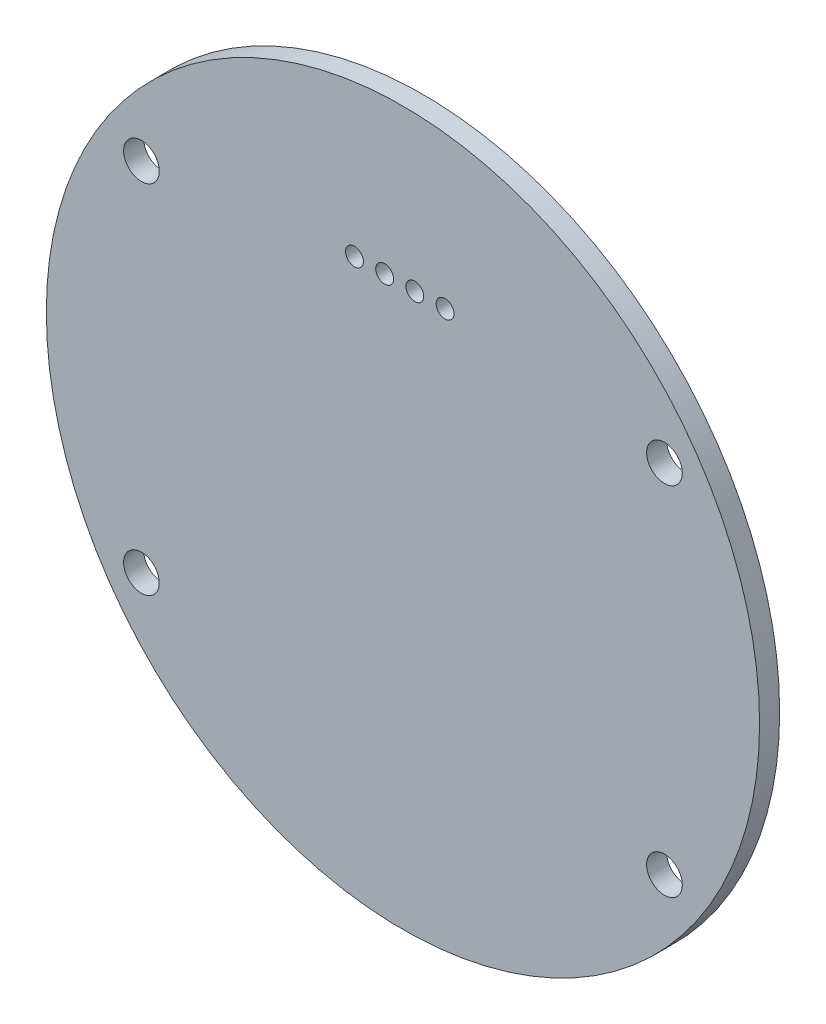
ISO-10303-21;
HEADER;
FILE_DESCRIPTION(('STEP AP214'),'2;1');
FILE_NAME('part.step','',(''),(''),'','','');
FILE_SCHEMA(('AUTOMOTIVE_DESIGN { 1 0 10303 214 1 1 1 1 }'));
ENDSEC;
DATA;
#1=APPLICATION_CONTEXT('core data for automotive mechanical design processes');
#2=APPLICATION_PROTOCOL_DEFINITION('international standard','automotive_design',2000,#1);
#3=PRODUCT_CONTEXT('',#1,'mechanical');
#4=PRODUCT('Part','Part','',(#3));
#5=PRODUCT_RELATED_PRODUCT_CATEGORY('part','',(#4));
#6=PRODUCT_DEFINITION_FORMATION('','',#4);
#7=PRODUCT_DEFINITION_CONTEXT('part definition',#1,'design');
#8=PRODUCT_DEFINITION('design','',#6,#7);
#9=PRODUCT_DEFINITION_SHAPE('','',#8);
#10=(LENGTH_UNIT() NAMED_UNIT(*) SI_UNIT(.MILLI.,.METRE.));
#11=(NAMED_UNIT(*) PLANE_ANGLE_UNIT() SI_UNIT($,.RADIAN.));
#12=(NAMED_UNIT(*) SI_UNIT($,.STERADIAN.) SOLID_ANGLE_UNIT());
#13=UNCERTAINTY_MEASURE_WITH_UNIT(LENGTH_MEASURE(1.E-05),#10,'distance_accuracy_value','');
#14=(GEOMETRIC_REPRESENTATION_CONTEXT(3) GLOBAL_UNCERTAINTY_ASSIGNED_CONTEXT((#13)) GLOBAL_UNIT_ASSIGNED_CONTEXT((#10,
#11,#12)) REPRESENTATION_CONTEXT('',''));
#15=CARTESIAN_POINT('',(0.,0.,0.));
#16=DIRECTION('',(0.,0.,1.));
#17=DIRECTION('',(1.,0.,0.));
#18=AXIS2_PLACEMENT_3D('',#15,#16,#17);
#19=CARTESIAN_POINT('',(0.,0.,0.));
#20=DIRECTION('',(0.,0.,-1.));
#21=DIRECTION('',(1.,0.,0.));
#22=AXIS2_PLACEMENT_3D('',#19,#20,#21);
#23=CYLINDRICAL_SURFACE('',#22,30.);
#24=CARTESIAN_POINT('',(0.,0.,1.69143934));
#25=DIRECTION('',(0.,0.,1.));
#26=DIRECTION('',(1.,0.,0.));
#27=AXIS2_PLACEMENT_3D('',#24,#25,#26);
#28=CIRCLE('',#27,30.);
#29=CARTESIAN_POINT('',(30.,0.,1.69143934));
#30=VERTEX_POINT('',#29);
#31=EDGE_CURVE('E11',#30,#30,#28,.T.);
#32=ORIENTED_EDGE('',*,*,#31,.F.);
#33=DIRECTION('',(0.,0.,1.));
#34=VECTOR('',#33,1.);
#35=CARTESIAN_POINT('',(30.,0.,0.));
#36=LINE('',#35,#34);
#37=CARTESIAN_POINT('',(30.,0.,0.));
#38=VERTEX_POINT('',#37);
#39=EDGE_CURVE('E23',#38,#30,#36,.T.);
#40=ORIENTED_EDGE('',*,*,#39,.F.);
#41=CARTESIAN_POINT('',(0.,0.,0.));
#42=DIRECTION('',(0.,0.,1.));
#43=DIRECTION('',(1.,0.,0.));
#44=AXIS2_PLACEMENT_3D('',#41,#42,#43);
#45=CIRCLE('',#44,30.);
#46=EDGE_CURVE('E149',#38,#38,#45,.T.);
#47=ORIENTED_EDGE('',*,*,#46,.T.);
#48=ORIENTED_EDGE('',*,*,#39,.T.);
#49=EDGE_LOOP('',(#32,#40,#47,#48));
#50=FACE_BOUND('',#49,.T.);
#51=ADVANCED_FACE('F16',(#50),#23,.T.);
#52=CARTESIAN_POINT('',(-21.99999918,15.00000048,0.));
#53=DIRECTION('',(0.,0.,-1.));
#54=DIRECTION('',(1.,0.,0.));
#55=AXIS2_PLACEMENT_3D('',#52,#53,#54);
#56=CYLINDRICAL_SURFACE('',#55,1.49999954);
#57=DIRECTION('',(0.,0.,1.));
#58=VECTOR('',#57,1.);
#59=CARTESIAN_POINT('',(-20.49999964,15.00000048,0.));
#60=LINE('',#59,#58);
#61=CARTESIAN_POINT('',(-20.49999964,15.00000048,0.));
#62=VERTEX_POINT('',#61);
#63=CARTESIAN_POINT('',(-20.49999964,15.00000048,1.69143934));
#64=VERTEX_POINT('',#63);
#65=EDGE_CURVE('E147',#62,#64,#60,.T.);
#66=ORIENTED_EDGE('',*,*,#65,.T.);
#67=CARTESIAN_POINT('',(-21.99999918,15.00000048,1.69143934));
#68=DIRECTION('',(0.,0.,1.));
#69=DIRECTION('',(1.,0.,0.));
#70=AXIS2_PLACEMENT_3D('',#67,#68,#69);
#71=CIRCLE('',#70,1.49999954);
#72=EDGE_CURVE('E144',#64,#64,#71,.T.);
#73=ORIENTED_EDGE('',*,*,#72,.T.);
#74=ORIENTED_EDGE('',*,*,#65,.F.);
#75=CARTESIAN_POINT('',(-21.99999918,15.00000048,0.));
#76=DIRECTION('',(0.,0.,1.));
#77=DIRECTION('',(1.,0.,0.));
#78=AXIS2_PLACEMENT_3D('',#75,#76,#77);
#79=CIRCLE('',#78,1.49999954);
#80=EDGE_CURVE('E141',#62,#62,#79,.T.);
#81=ORIENTED_EDGE('',*,*,#80,.F.);
#82=EDGE_LOOP('',(#66,#73,#74,#81));
#83=FACE_BOUND('',#82,.T.);
#84=ADVANCED_FACE('F182',(#83),#56,.F.);
#85=CARTESIAN_POINT('',(-21.99999918,-15.00000048,0.));
#86=DIRECTION('',(0.,0.,-1.));
#87=DIRECTION('',(1.,0.,0.));
#88=AXIS2_PLACEMENT_3D('',#85,#86,#87);
#89=CYLINDRICAL_SURFACE('',#88,1.49999954);
#90=DIRECTION('',(0.,0.,1.));
#91=VECTOR('',#90,1.);
#92=CARTESIAN_POINT('',(-20.49999964,-15.00000048,0.));
#93=LINE('',#92,#91);
#94=CARTESIAN_POINT('',(-20.49999964,-15.00000048,0.));
#95=VERTEX_POINT('',#94);
#96=CARTESIAN_POINT('',(-20.49999964,-15.00000048,1.69143934));
#97=VERTEX_POINT('',#96);
#98=EDGE_CURVE('E139',#95,#97,#93,.T.);
#99=ORIENTED_EDGE('',*,*,#98,.T.);
#100=CARTESIAN_POINT('',(-21.99999918,-15.00000048,1.69143934));
#101=DIRECTION('',(0.,0.,1.));
#102=DIRECTION('',(1.,0.,0.));
#103=AXIS2_PLACEMENT_3D('',#100,#101,#102);
#104=CIRCLE('',#103,1.49999954);
#105=EDGE_CURVE('E136',#97,#97,#104,.T.);
#106=ORIENTED_EDGE('',*,*,#105,.T.);
#107=ORIENTED_EDGE('',*,*,#98,.F.);
#108=CARTESIAN_POINT('',(-21.99999918,-15.00000048,0.));
#109=DIRECTION('',(0.,0.,1.));
#110=DIRECTION('',(1.,0.,0.));
#111=AXIS2_PLACEMENT_3D('',#108,#109,#110);
#112=CIRCLE('',#111,1.49999954);
#113=EDGE_CURVE('E133',#95,#95,#112,.T.);
#114=ORIENTED_EDGE('',*,*,#113,.F.);
#115=EDGE_LOOP('',(#99,#106,#107,#114));
#116=FACE_BOUND('',#115,.T.);
#117=ADVANCED_FACE('F186',(#116),#89,.F.);
#118=CARTESIAN_POINT('',(-4.07999946000001,16.99999902,0.));
#119=DIRECTION('',(0.,0.,-1.));
#120=DIRECTION('',(1.,0.,0.));
#121=AXIS2_PLACEMENT_3D('',#118,#119,#120);
#122=CYLINDRICAL_SURFACE('',#121,0.7499985);
#123=DIRECTION('',(0.,0.,1.));
#124=VECTOR('',#123,1.);
#125=CARTESIAN_POINT('',(-3.33000096000001,16.99999902,0.));
#126=LINE('',#125,#124);
#127=CARTESIAN_POINT('',(-3.33000096000001,16.99999902,0.));
#128=VERTEX_POINT('',#127);
#129=CARTESIAN_POINT('',(-3.33000096000001,16.99999902,1.69143934));
#130=VERTEX_POINT('',#129);
#131=EDGE_CURVE('E131',#128,#130,#126,.T.);
#132=ORIENTED_EDGE('',*,*,#131,.T.);
#133=CARTESIAN_POINT('',(-4.07999946000001,16.99999902,1.69143934));
#134=DIRECTION('',(0.,0.,1.));
#135=DIRECTION('',(1.,0.,0.));
#136=AXIS2_PLACEMENT_3D('',#133,#134,#135);
#137=CIRCLE('',#136,0.7499985);
#138=EDGE_CURVE('E128',#130,#130,#137,.T.);
#139=ORIENTED_EDGE('',*,*,#138,.T.);
#140=ORIENTED_EDGE('',*,*,#131,.F.);
#141=CARTESIAN_POINT('',(-4.07999946000001,16.99999902,0.));
#142=DIRECTION('',(0.,0.,1.));
#143=DIRECTION('',(1.,0.,0.));
#144=AXIS2_PLACEMENT_3D('',#141,#142,#143);
#145=CIRCLE('',#144,0.7499985);
#146=EDGE_CURVE('E125',#128,#128,#145,.T.);
#147=ORIENTED_EDGE('',*,*,#146,.F.);
#148=EDGE_LOOP('',(#132,#139,#140,#147));
#149=FACE_BOUND('',#148,.T.);
#150=ADVANCED_FACE('F191',(#149),#122,.F.);
#151=CARTESIAN_POINT('',(-1.53999946000001,16.99999902,0.));
#152=DIRECTION('',(0.,0.,-1.));
#153=DIRECTION('',(1.,0.,0.));
#154=AXIS2_PLACEMENT_3D('',#151,#152,#153);
#155=CYLINDRICAL_SURFACE('',#154,0.7499985);
#156=DIRECTION('',(0.,0.,1.));
#157=VECTOR('',#156,1.);
#158=CARTESIAN_POINT('',(-0.790000960000011,16.99999902,0.));
#159=LINE('',#158,#157);
#160=CARTESIAN_POINT('',(-0.790000960000011,16.99999902,0.));
#161=VERTEX_POINT('',#160);
#162=CARTESIAN_POINT('',(-0.790000960000011,16.99999902,1.69143934));
#163=VERTEX_POINT('',#162);
#164=EDGE_CURVE('E123',#161,#163,#159,.T.);
#165=ORIENTED_EDGE('',*,*,#164,.T.);
#166=CARTESIAN_POINT('',(-1.53999946000001,16.99999902,1.69143934));
#167=DIRECTION('',(0.,0.,1.));
#168=DIRECTION('',(1.,0.,0.));
#169=AXIS2_PLACEMENT_3D('',#166,#167,#168);
#170=CIRCLE('',#169,0.7499985);
#171=EDGE_CURVE('E120',#163,#163,#170,.T.);
#172=ORIENTED_EDGE('',*,*,#171,.T.);
#173=ORIENTED_EDGE('',*,*,#164,.F.);
#174=CARTESIAN_POINT('',(-1.53999946000001,16.99999902,0.));
#175=DIRECTION('',(0.,0.,1.));
#176=DIRECTION('',(1.,0.,0.));
#177=AXIS2_PLACEMENT_3D('',#174,#175,#176);
#178=CIRCLE('',#177,0.7499985);
#179=EDGE_CURVE('E117',#161,#161,#178,.T.);
#180=ORIENTED_EDGE('',*,*,#179,.F.);
#181=EDGE_LOOP('',(#165,#172,#173,#180));
#182=FACE_BOUND('',#181,.T.);
#183=ADVANCED_FACE('F197',(#182),#155,.F.);
#184=CARTESIAN_POINT('',(21.99999918,15.00000048,0.));
#185=DIRECTION('',(0.,0.,-1.));
#186=DIRECTION('',(1.,0.,0.));
#187=AXIS2_PLACEMENT_3D('',#184,#185,#186);
#188=CYLINDRICAL_SURFACE('',#187,1.49999954);
#189=DIRECTION('',(0.,0.,1.));
#190=VECTOR('',#189,1.);
#191=CARTESIAN_POINT('',(23.49999872,15.00000048,0.));
#192=LINE('',#191,#190);
#193=CARTESIAN_POINT('',(23.49999872,15.00000048,0.));
#194=VERTEX_POINT('',#193);
#195=CARTESIAN_POINT('',(23.49999872,15.00000048,1.69143934));
#196=VERTEX_POINT('',#195);
#197=EDGE_CURVE('E115',#194,#196,#192,.T.);
#198=ORIENTED_EDGE('',*,*,#197,.T.);
#199=CARTESIAN_POINT('',(21.99999918,15.00000048,1.69143934));
#200=DIRECTION('',(0.,0.,1.));
#201=DIRECTION('',(1.,0.,0.));
#202=AXIS2_PLACEMENT_3D('',#199,#200,#201);
#203=CIRCLE('',#202,1.49999954);
#204=EDGE_CURVE('E112',#196,#196,#203,.T.);
#205=ORIENTED_EDGE('',*,*,#204,.T.);
#206=ORIENTED_EDGE('',*,*,#197,.F.);
#207=CARTESIAN_POINT('',(21.99999918,15.00000048,0.));
#208=DIRECTION('',(0.,0.,1.));
#209=DIRECTION('',(1.,0.,0.));
#210=AXIS2_PLACEMENT_3D('',#207,#208,#209);
#211=CIRCLE('',#210,1.49999954);
#212=EDGE_CURVE('E109',#194,#194,#211,.T.);
#213=ORIENTED_EDGE('',*,*,#212,.F.);
#214=EDGE_LOOP('',(#198,#205,#206,#213));
#215=FACE_BOUND('',#214,.T.);
#216=ADVANCED_FACE('F201',(#215),#188,.F.);
#217=CARTESIAN_POINT('',(21.99999918,-15.00000048,0.));
#218=DIRECTION('',(0.,0.,-1.));
#219=DIRECTION('',(1.,0.,0.));
#220=AXIS2_PLACEMENT_3D('',#217,#218,#219);
#221=CYLINDRICAL_SURFACE('',#220,1.49999954);
#222=DIRECTION('',(0.,0.,1.));
#223=VECTOR('',#222,1.);
#224=CARTESIAN_POINT('',(23.49999872,-15.00000048,0.));
#225=LINE('',#224,#223);
#226=CARTESIAN_POINT('',(23.49999872,-15.00000048,0.));
#227=VERTEX_POINT('',#226);
#228=CARTESIAN_POINT('',(23.49999872,-15.00000048,1.69143934));
#229=VERTEX_POINT('',#228);
#230=EDGE_CURVE('E107',#227,#229,#225,.T.);
#231=ORIENTED_EDGE('',*,*,#230,.T.);
#232=CARTESIAN_POINT('',(21.99999918,-15.00000048,1.69143934));
#233=DIRECTION('',(0.,0.,1.));
#234=DIRECTION('',(1.,0.,0.));
#235=AXIS2_PLACEMENT_3D('',#232,#233,#234);
#236=CIRCLE('',#235,1.49999954);
#237=EDGE_CURVE('E104',#229,#229,#236,.T.);
#238=ORIENTED_EDGE('',*,*,#237,.T.);
#239=ORIENTED_EDGE('',*,*,#230,.F.);
#240=CARTESIAN_POINT('',(21.99999918,-15.00000048,0.));
#241=DIRECTION('',(0.,0.,1.));
#242=DIRECTION('',(1.,0.,0.));
#243=AXIS2_PLACEMENT_3D('',#240,#241,#242);
#244=CIRCLE('',#243,1.49999954);
#245=EDGE_CURVE('E101',#227,#227,#244,.T.);
#246=ORIENTED_EDGE('',*,*,#245,.F.);
#247=EDGE_LOOP('',(#231,#238,#239,#246));
#248=FACE_BOUND('',#247,.T.);
#249=ADVANCED_FACE('F205',(#248),#221,.F.);
#250=CARTESIAN_POINT('',(1.00000053999999,16.99999902,0.));
#251=DIRECTION('',(0.,0.,-1.));
#252=DIRECTION('',(1.,0.,0.));
#253=AXIS2_PLACEMENT_3D('',#250,#251,#252);
#254=CYLINDRICAL_SURFACE('',#253,0.7499985);
#255=DIRECTION('',(0.,0.,1.));
#256=VECTOR('',#255,1.);
#257=CARTESIAN_POINT('',(1.74999903999999,16.99999902,0.));
#258=LINE('',#257,#256);
#259=CARTESIAN_POINT('',(1.74999903999999,16.99999902,0.));
#260=VERTEX_POINT('',#259);
#261=CARTESIAN_POINT('',(1.74999903999999,16.99999902,1.69143934));
#262=VERTEX_POINT('',#261);
#263=EDGE_CURVE('E99',#260,#262,#258,.T.);
#264=ORIENTED_EDGE('',*,*,#263,.T.);
#265=CARTESIAN_POINT('',(1.00000053999999,16.99999902,1.69143934));
#266=DIRECTION('',(0.,0.,1.));
#267=DIRECTION('',(1.,0.,0.));
#268=AXIS2_PLACEMENT_3D('',#265,#266,#267);
#269=CIRCLE('',#268,0.7499985);
#270=EDGE_CURVE('E96',#262,#262,#269,.T.);
#271=ORIENTED_EDGE('',*,*,#270,.T.);
#272=ORIENTED_EDGE('',*,*,#263,.F.);
#273=CARTESIAN_POINT('',(1.00000053999999,16.99999902,0.));
#274=DIRECTION('',(0.,0.,1.));
#275=DIRECTION('',(1.,0.,0.));
#276=AXIS2_PLACEMENT_3D('',#273,#274,#275);
#277=CIRCLE('',#276,0.7499985);
#278=EDGE_CURVE('E87',#260,#260,#277,.T.);
#279=ORIENTED_EDGE('',*,*,#278,.F.);
#280=EDGE_LOOP('',(#264,#271,#272,#279));
#281=FACE_BOUND('',#280,.T.);
#282=ADVANCED_FACE('F170',(#281),#254,.F.);
#283=CARTESIAN_POINT('',(3.54000053999999,16.99999902,0.));
#284=DIRECTION('',(0.,0.,-1.));
#285=DIRECTION('',(1.,0.,0.));
#286=AXIS2_PLACEMENT_3D('',#283,#284,#285);
#287=CYLINDRICAL_SURFACE('',#286,0.7499985);
#288=DIRECTION('',(0.,0.,1.));
#289=VECTOR('',#288,1.);
#290=CARTESIAN_POINT('',(4.28999903999999,16.99999902,0.));
#291=LINE('',#290,#289);
#292=CARTESIAN_POINT('',(4.28999903999999,16.99999902,0.));
#293=VERTEX_POINT('',#292);
#294=CARTESIAN_POINT('',(4.28999903999999,16.99999902,1.69143934));
#295=VERTEX_POINT('',#294);
#296=EDGE_CURVE('E81',#293,#295,#291,.T.);
#297=ORIENTED_EDGE('',*,*,#296,.T.);
#298=CARTESIAN_POINT('',(3.54000053999999,16.99999902,1.69143934));
#299=DIRECTION('',(0.,0.,1.));
#300=DIRECTION('',(1.,0.,0.));
#301=AXIS2_PLACEMENT_3D('',#298,#299,#300);
#302=CIRCLE('',#301,0.7499985);
#303=EDGE_CURVE('E86',#295,#295,#302,.T.);
#304=ORIENTED_EDGE('',*,*,#303,.T.);
#305=ORIENTED_EDGE('',*,*,#296,.F.);
#306=CARTESIAN_POINT('',(3.54000053999999,16.99999902,0.));
#307=DIRECTION('',(0.,0.,1.));
#308=DIRECTION('',(1.,0.,0.));
#309=AXIS2_PLACEMENT_3D('',#306,#307,#308);
#310=CIRCLE('',#309,0.7499985);
#311=EDGE_CURVE('E84',#293,#293,#310,.T.);
#312=ORIENTED_EDGE('',*,*,#311,.F.);
#313=EDGE_LOOP('',(#297,#304,#305,#312));
#314=FACE_BOUND('',#313,.T.);
#315=ADVANCED_FACE('F83',(#314),#287,.F.);
#316=CARTESIAN_POINT('',(30.,0.,0.));
#317=DIRECTION('',(0.,0.,-1.));
#318=DIRECTION('',(-1.,0.,0.));
#319=AXIS2_PLACEMENT_3D('',#316,#317,#318);
#320=PLANE('',#319);
#321=ORIENTED_EDGE('',*,*,#46,.F.);
#322=EDGE_LOOP('',(#321));
#323=FACE_BOUND('',#322,.T.);
#324=ORIENTED_EDGE('',*,*,#80,.T.);
#325=EDGE_LOOP('',(#324));
#326=FACE_BOUND('',#325,.T.);
#327=ORIENTED_EDGE('',*,*,#113,.T.);
#328=EDGE_LOOP('',(#327));
#329=FACE_BOUND('',#328,.T.);
#330=ORIENTED_EDGE('',*,*,#146,.T.);
#331=EDGE_LOOP('',(#330));
#332=FACE_BOUND('',#331,.T.);
#333=ORIENTED_EDGE('',*,*,#179,.T.);
#334=EDGE_LOOP('',(#333));
#335=FACE_BOUND('',#334,.T.);
#336=ORIENTED_EDGE('',*,*,#212,.T.);
#337=EDGE_LOOP('',(#336));
#338=FACE_BOUND('',#337,.T.);
#339=ORIENTED_EDGE('',*,*,#245,.T.);
#340=EDGE_LOOP('',(#339));
#341=FACE_BOUND('',#340,.T.);
#342=ORIENTED_EDGE('',*,*,#278,.T.);
#343=EDGE_LOOP('',(#342));
#344=FACE_BOUND('',#343,.T.);
#345=ORIENTED_EDGE('',*,*,#311,.T.);
#346=EDGE_LOOP('',(#345));
#347=FACE_BOUND('',#346,.T.);
#348=ADVANCED_FACE('F90',(#323,#326,#329,#332,#335,#338,#341,#344,#347),#320,.T.);
#349=CARTESIAN_POINT('',(30.,0.,1.69143934));
#350=DIRECTION('',(0.,0.,-1.));
#351=DIRECTION('',(-1.,0.,0.));
#352=AXIS2_PLACEMENT_3D('',#349,#350,#351);
#353=PLANE('',#352);
#354=ORIENTED_EDGE('',*,*,#31,.T.);
#355=EDGE_LOOP('',(#354));
#356=FACE_BOUND('',#355,.T.);
#357=ORIENTED_EDGE('',*,*,#72,.F.);
#358=EDGE_LOOP('',(#357));
#359=FACE_BOUND('',#358,.T.);
#360=ORIENTED_EDGE('',*,*,#105,.F.);
#361=EDGE_LOOP('',(#360));
#362=FACE_BOUND('',#361,.T.);
#363=ORIENTED_EDGE('',*,*,#138,.F.);
#364=EDGE_LOOP('',(#363));
#365=FACE_BOUND('',#364,.T.);
#366=ORIENTED_EDGE('',*,*,#171,.F.);
#367=EDGE_LOOP('',(#366));
#368=FACE_BOUND('',#367,.T.);
#369=ORIENTED_EDGE('',*,*,#204,.F.);
#370=EDGE_LOOP('',(#369));
#371=FACE_BOUND('',#370,.T.);
#372=ORIENTED_EDGE('',*,*,#237,.F.);
#373=EDGE_LOOP('',(#372));
#374=FACE_BOUND('',#373,.T.);
#375=ORIENTED_EDGE('',*,*,#270,.F.);
#376=EDGE_LOOP('',(#375));
#377=FACE_BOUND('',#376,.T.);
#378=ORIENTED_EDGE('',*,*,#303,.F.);
#379=EDGE_LOOP('',(#378));
#380=FACE_BOUND('',#379,.T.);
#381=ADVANCED_FACE('F154',(#356,#359,#362,#365,#368,#371,#374,#377,#380),#353,.F.);
#382=CLOSED_SHELL('',(#51,#84,#117,#150,#183,#216,#249,#282,#315,#348,#381));
#383=MANIFOLD_SOLID_BREP('B1',#382);
#384=ADVANCED_BREP_SHAPE_REPRESENTATION('',(#18,#383),#14);
#385=SHAPE_DEFINITION_REPRESENTATION(#9,#384);
ENDSEC;
END-ISO-10303-21;
